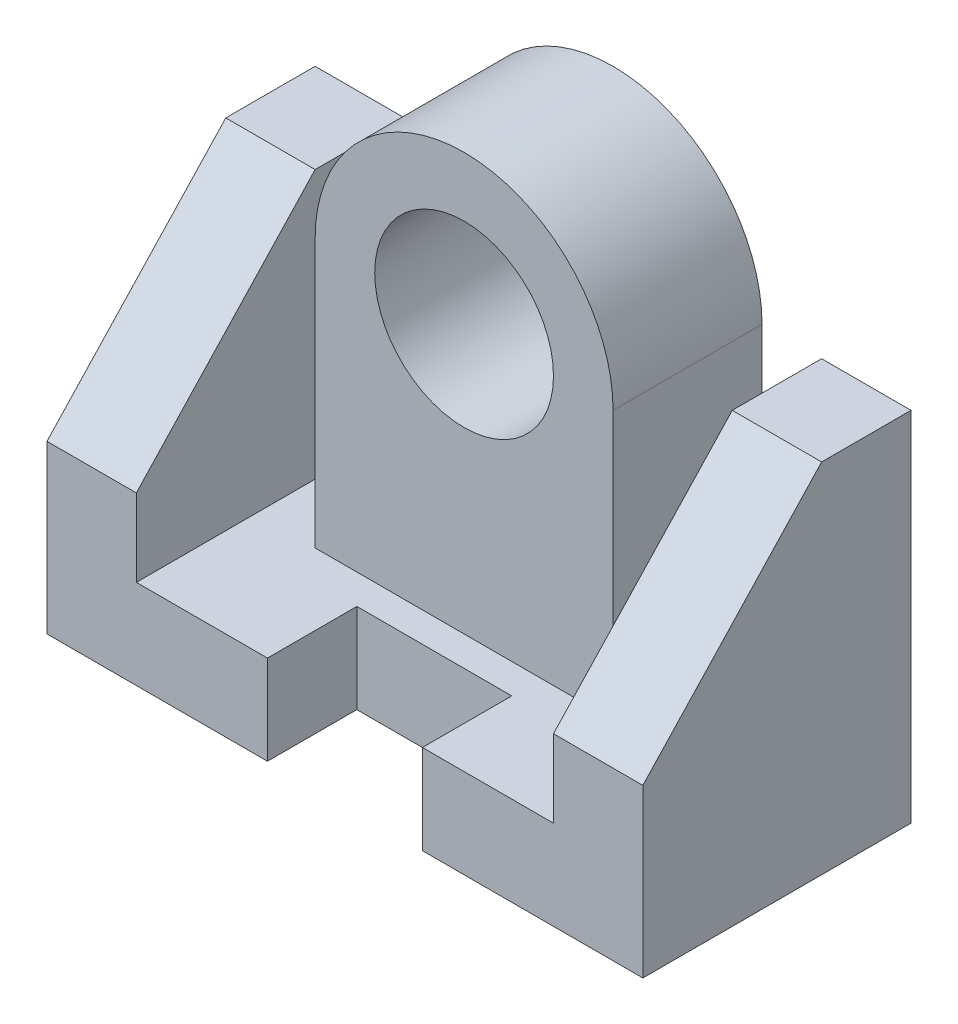
ISO-10303-21;
HEADER;
FILE_DESCRIPTION(('STEP AP214'),'2;1');
FILE_NAME('part.step','',(''),(''),'','','');
FILE_SCHEMA(('AUTOMOTIVE_DESIGN { 1 0 10303 214 1 1 1 1 }'));
ENDSEC;
DATA;
#1=APPLICATION_CONTEXT('core data for automotive mechanical design processes');
#2=APPLICATION_PROTOCOL_DEFINITION('international standard','automotive_design',2000,#1);
#3=PRODUCT_CONTEXT('',#1,'mechanical');
#4=PRODUCT('Part','Part','',(#3));
#5=PRODUCT_RELATED_PRODUCT_CATEGORY('part','',(#4));
#6=PRODUCT_DEFINITION_FORMATION('','',#4);
#7=PRODUCT_DEFINITION_CONTEXT('part definition',#1,'design');
#8=PRODUCT_DEFINITION('design','',#6,#7);
#9=PRODUCT_DEFINITION_SHAPE('','',#8);
#10=(LENGTH_UNIT() NAMED_UNIT(*) SI_UNIT(.MILLI.,.METRE.));
#11=(NAMED_UNIT(*) PLANE_ANGLE_UNIT() SI_UNIT($,.RADIAN.));
#12=(NAMED_UNIT(*) SI_UNIT($,.STERADIAN.) SOLID_ANGLE_UNIT());
#13=UNCERTAINTY_MEASURE_WITH_UNIT(LENGTH_MEASURE(1.E-05),#10,'distance_accuracy_value','');
#14=(GEOMETRIC_REPRESENTATION_CONTEXT(3) GLOBAL_UNCERTAINTY_ASSIGNED_CONTEXT((#13)) GLOBAL_UNIT_ASSIGNED_CONTEXT((#10,
#11,#12)) REPRESENTATION_CONTEXT('',''));
#15=CARTESIAN_POINT('',(0.,0.,0.));
#16=DIRECTION('',(0.,0.,1.));
#17=DIRECTION('',(1.,0.,0.));
#18=AXIS2_PLACEMENT_3D('',#15,#16,#17);
#19=CARTESIAN_POINT('',(-35.,15.,45.));
#20=DIRECTION('',(0.,-1.,0.));
#21=DIRECTION('',(0.,0.,-1.));
#22=AXIS2_PLACEMENT_3D('',#19,#20,#21);
#23=PLANE('',#22);
#24=DIRECTION('',(0.,0.,-1.));
#25=VECTOR('',#24,1.);
#26=CARTESIAN_POINT('',(25.,15.,25.));
#27=LINE('',#26,#25);
#28=CARTESIAN_POINT('',(25.,15.,25.));
#29=VERTEX_POINT('',#28);
#30=CARTESIAN_POINT('',(25.,15.,0.));
#31=VERTEX_POINT('',#30);
#32=EDGE_CURVE('E196',#29,#31,#27,.T.);
#33=ORIENTED_EDGE('',*,*,#32,.F.);
#34=DIRECTION('',(-1.,0.,0.));
#35=VECTOR('',#34,1.);
#36=CARTESIAN_POINT('',(25.,15.,25.));
#37=LINE('',#36,#35);
#38=CARTESIAN_POINT('',(-25.,15.,25.));
#39=VERTEX_POINT('',#38);
#40=EDGE_CURVE('E59',#29,#39,#37,.T.);
#41=ORIENTED_EDGE('',*,*,#40,.T.);
#42=DIRECTION('',(0.,0.,-1.));
#43=VECTOR('',#42,1.);
#44=CARTESIAN_POINT('',(-25.,15.,25.));
#45=LINE('',#44,#43);
#46=CARTESIAN_POINT('',(-25.,15.,0.));
#47=VERTEX_POINT('',#46);
#48=EDGE_CURVE('E65',#39,#47,#45,.T.);
#49=ORIENTED_EDGE('',*,*,#48,.T.);
#50=DIRECTION('',(-1.,0.,0.));
#51=VECTOR('',#50,1.);
#52=CARTESIAN_POINT('',(-35.,15.,0.));
#53=LINE('',#52,#51);
#54=CARTESIAN_POINT('',(-35.,15.,0.));
#55=VERTEX_POINT('',#54);
#56=EDGE_CURVE('E273',#47,#55,#53,.T.);
#57=ORIENTED_EDGE('',*,*,#56,.T.);
#58=DIRECTION('',(0.,0.,-1.));
#59=VECTOR('',#58,1.);
#60=CARTESIAN_POINT('',(-35.,15.,45.));
#61=LINE('',#60,#59);
#62=CARTESIAN_POINT('',(-35.,15.,45.));
#63=VERTEX_POINT('',#62);
#64=EDGE_CURVE('E292',#63,#55,#61,.T.);
#65=ORIENTED_EDGE('',*,*,#64,.F.);
#66=DIRECTION('',(-1.,0.,0.));
#67=VECTOR('',#66,1.);
#68=CARTESIAN_POINT('',(-35.,15.,45.));
#69=LINE('',#68,#67);
#70=CARTESIAN_POINT('',(-13.,15.,45.));
#71=VERTEX_POINT('',#70);
#72=EDGE_CURVE('E255',#71,#63,#69,.T.);
#73=ORIENTED_EDGE('',*,*,#72,.F.);
#74=DIRECTION('',(0.,0.,1.));
#75=VECTOR('',#74,1.);
#76=CARTESIAN_POINT('',(-13.,15.,45.));
#77=LINE('',#76,#75);
#78=CARTESIAN_POINT('',(-13.,15.,30.));
#79=VERTEX_POINT('',#78);
#80=EDGE_CURVE('E208',#79,#71,#77,.T.);
#81=ORIENTED_EDGE('',*,*,#80,.F.);
#82=DIRECTION('',(-1.,0.,0.));
#83=VECTOR('',#82,1.);
#84=CARTESIAN_POINT('',(-13.,15.,30.));
#85=LINE('',#84,#83);
#86=CARTESIAN_POINT('',(13.,15.,30.));
#87=VERTEX_POINT('',#86);
#88=EDGE_CURVE('E216',#87,#79,#85,.T.);
#89=ORIENTED_EDGE('',*,*,#88,.F.);
#90=DIRECTION('',(0.,0.,-1.));
#91=VECTOR('',#90,1.);
#92=CARTESIAN_POINT('',(13.,15.,30.));
#93=LINE('',#92,#91);
#94=CARTESIAN_POINT('',(13.,15.,45.));
#95=VERTEX_POINT('',#94);
#96=EDGE_CURVE('E203',#95,#87,#93,.T.);
#97=ORIENTED_EDGE('',*,*,#96,.F.);
#98=CARTESIAN_POINT('',(35.,15.,45.));
#99=VERTEX_POINT('',#98);
#100=EDGE_CURVE('E254',#99,#95,#69,.T.);
#101=ORIENTED_EDGE('',*,*,#100,.F.);
#102=DIRECTION('',(0.,0.,-1.));
#103=VECTOR('',#102,1.);
#104=CARTESIAN_POINT('',(35.,15.,45.));
#105=LINE('',#104,#103);
#106=CARTESIAN_POINT('',(35.,15.,0.));
#107=VERTEX_POINT('',#106);
#108=EDGE_CURVE('E294',#99,#107,#105,.T.);
#109=ORIENTED_EDGE('',*,*,#108,.T.);
#110=EDGE_CURVE('E274',#107,#31,#53,.T.);
#111=ORIENTED_EDGE('',*,*,#110,.T.);
#112=EDGE_LOOP('',(#33,#41,#49,#57,#65,#73,#81,#89,#97,#101,#109,#111));
#113=FACE_BOUND('',#112,.T.);
#114=ADVANCED_FACE('F41',(#113),#23,.F.);
#115=CARTESIAN_POINT('',(0.,0.,45.));
#116=DIRECTION('',(0.,0.,-1.));
#117=DIRECTION('',(-1.,0.,0.));
#118=AXIS2_PLACEMENT_3D('',#115,#116,#117);
#119=PLANE('',#118);
#120=DIRECTION('',(0.,1.,0.));
#121=VECTOR('',#120,1.);
#122=CARTESIAN_POINT('',(13.,0.,45.));
#123=LINE('',#122,#121);
#124=CARTESIAN_POINT('',(13.,0.,45.));
#125=VERTEX_POINT('',#124);
#126=EDGE_CURVE('E212',#125,#95,#123,.T.);
#127=ORIENTED_EDGE('',*,*,#126,.F.);
#128=DIRECTION('',(1.,0.,0.));
#129=VECTOR('',#128,1.);
#130=CARTESIAN_POINT('',(50.,0.,45.));
#131=LINE('',#130,#129);
#132=CARTESIAN_POINT('',(50.,0.,45.));
#133=VERTEX_POINT('',#132);
#134=EDGE_CURVE('E246',#125,#133,#131,.T.);
#135=ORIENTED_EDGE('',*,*,#134,.T.);
#136=DIRECTION('',(0.,1.,0.));
#137=VECTOR('',#136,1.);
#138=CARTESIAN_POINT('',(50.,60.,45.));
#139=LINE('',#138,#137);
#140=CARTESIAN_POINT('',(50.,28.,45.));
#141=VERTEX_POINT('',#140);
#142=EDGE_CURVE('E249',#133,#141,#139,.T.);
#143=ORIENTED_EDGE('',*,*,#142,.T.);
#144=DIRECTION('',(1.,0.,0.));
#145=VECTOR('',#144,1.);
#146=CARTESIAN_POINT('',(-50.,28.,45.));
#147=LINE('',#146,#145);
#148=CARTESIAN_POINT('',(35.,28.,45.));
#149=VERTEX_POINT('',#148);
#150=EDGE_CURVE('E11',#149,#141,#147,.T.);
#151=ORIENTED_EDGE('',*,*,#150,.F.);
#152=DIRECTION('',(0.,-1.,0.));
#153=VECTOR('',#152,1.);
#154=CARTESIAN_POINT('',(35.,15.,45.));
#155=LINE('',#154,#153);
#156=EDGE_CURVE('E252',#149,#99,#155,.T.);
#157=ORIENTED_EDGE('',*,*,#156,.T.);
#158=ORIENTED_EDGE('',*,*,#100,.T.);
#159=EDGE_LOOP('',(#127,#135,#143,#151,#157,#158));
#160=FACE_BOUND('',#159,.T.);
#161=ADVANCED_FACE('F332',(#160),#119,.F.);
#162=CARTESIAN_POINT('',(50.,60.,45.));
#163=DIRECTION('',(-1.,0.,0.));
#164=DIRECTION('',(0.,0.,1.));
#165=AXIS2_PLACEMENT_3D('',#162,#163,#164);
#166=PLANE('',#165);
#167=DIRECTION('',(0.,0.729537204140085,-0.68394112888133));
#168=VECTOR('',#167,1.);
#169=CARTESIAN_POINT('',(50.,28.,45.));
#170=LINE('',#169,#168);
#171=CARTESIAN_POINT('',(50.,60.,15.));
#172=VERTEX_POINT('',#171);
#173=EDGE_CURVE('E224',#141,#172,#170,.T.);
#174=ORIENTED_EDGE('',*,*,#173,.F.);
#175=ORIENTED_EDGE('',*,*,#142,.F.);
#176=DIRECTION('',(0.,0.,-1.));
#177=VECTOR('',#176,1.);
#178=CARTESIAN_POINT('',(50.,0.,45.));
#179=LINE('',#178,#177);
#180=CARTESIAN_POINT('',(50.,0.,0.));
#181=VERTEX_POINT('',#180);
#182=EDGE_CURVE('E44',#133,#181,#179,.T.);
#183=ORIENTED_EDGE('',*,*,#182,.T.);
#184=DIRECTION('',(0.,1.,0.));
#185=VECTOR('',#184,1.);
#186=CARTESIAN_POINT('',(50.,60.,0.));
#187=LINE('',#186,#185);
#188=CARTESIAN_POINT('',(50.,60.,0.));
#189=VERTEX_POINT('',#188);
#190=EDGE_CURVE('E266',#181,#189,#187,.T.);
#191=ORIENTED_EDGE('',*,*,#190,.T.);
#192=DIRECTION('',(0.,0.,-1.));
#193=VECTOR('',#192,1.);
#194=CARTESIAN_POINT('',(50.,60.,45.));
#195=LINE('',#194,#193);
#196=EDGE_CURVE('E297',#172,#189,#195,.T.);
#197=ORIENTED_EDGE('',*,*,#196,.F.);
#198=EDGE_LOOP('',(#174,#175,#183,#191,#197));
#199=FACE_BOUND('',#198,.T.);
#200=ADVANCED_FACE('F307',(#199),#166,.F.);
#201=CARTESIAN_POINT('',(-50.,0.,45.));
#202=VERTEX_POINT('',#201);
#203=CARTESIAN_POINT('',(-13.,0.,45.));
#204=VERTEX_POINT('',#203);
#205=EDGE_CURVE('E244',#202,#204,#131,.T.);
#206=ORIENTED_EDGE('',*,*,#205,.T.);
#207=DIRECTION('',(0.,1.,0.));
#208=VECTOR('',#207,1.);
#209=CARTESIAN_POINT('',(-13.,0.,45.));
#210=LINE('',#209,#208);
#211=EDGE_CURVE('E219',#204,#71,#210,.T.);
#212=ORIENTED_EDGE('',*,*,#211,.T.);
#213=ORIENTED_EDGE('',*,*,#72,.T.);
#214=DIRECTION('',(0.,1.,0.));
#215=VECTOR('',#214,1.);
#216=CARTESIAN_POINT('',(-35.,60.,45.));
#217=LINE('',#216,#215);
#218=CARTESIAN_POINT('',(-35.,28.,45.));
#219=VERTEX_POINT('',#218);
#220=EDGE_CURVE('E256',#63,#219,#217,.T.);
#221=ORIENTED_EDGE('',*,*,#220,.T.);
#222=CARTESIAN_POINT('',(-50.,28.,45.));
#223=VERTEX_POINT('',#222);
#224=EDGE_CURVE('E51',#223,#219,#147,.T.);
#225=ORIENTED_EDGE('',*,*,#224,.F.);
#226=DIRECTION('',(0.,-1.,0.));
#227=VECTOR('',#226,1.);
#228=CARTESIAN_POINT('',(-50.,0.,45.));
#229=LINE('',#228,#227);
#230=EDGE_CURVE('E261',#223,#202,#229,.T.);
#231=ORIENTED_EDGE('',*,*,#230,.T.);
#232=EDGE_LOOP('',(#206,#212,#213,#221,#225,#231));
#233=FACE_BOUND('',#232,.T.);
#234=ADVANCED_FACE('F341',(#233),#119,.F.);
#235=CARTESIAN_POINT('',(50.,0.,45.));
#236=DIRECTION('',(0.,1.,0.));
#237=DIRECTION('',(0.,0.,1.));
#238=AXIS2_PLACEMENT_3D('',#235,#236,#237);
#239=PLANE('',#238);
#240=DIRECTION('',(-1.,0.,0.));
#241=VECTOR('',#240,1.);
#242=CARTESIAN_POINT('',(-13.,0.,30.));
#243=LINE('',#242,#241);
#244=CARTESIAN_POINT('',(13.,0.,30.));
#245=VERTEX_POINT('',#244);
#246=CARTESIAN_POINT('',(-13.,0.,30.));
#247=VERTEX_POINT('',#246);
#248=EDGE_CURVE('E210',#245,#247,#243,.T.);
#249=ORIENTED_EDGE('',*,*,#248,.T.);
#250=DIRECTION('',(0.,0.,1.));
#251=VECTOR('',#250,1.);
#252=CARTESIAN_POINT('',(-13.,0.,45.));
#253=LINE('',#252,#251);
#254=EDGE_CURVE('E211',#247,#204,#253,.T.);
#255=ORIENTED_EDGE('',*,*,#254,.T.);
#256=ORIENTED_EDGE('',*,*,#205,.F.);
#257=DIRECTION('',(0.,0.,-1.));
#258=VECTOR('',#257,1.);
#259=CARTESIAN_POINT('',(-50.,0.,45.));
#260=LINE('',#259,#258);
#261=CARTESIAN_POINT('',(-50.,0.,0.));
#262=VERTEX_POINT('',#261);
#263=EDGE_CURVE('E263',#202,#262,#260,.T.);
#264=ORIENTED_EDGE('',*,*,#263,.T.);
#265=DIRECTION('',(1.,0.,0.));
#266=VECTOR('',#265,1.);
#267=CARTESIAN_POINT('',(50.,0.,0.));
#268=LINE('',#267,#266);
#269=EDGE_CURVE('E243',#262,#181,#268,.T.);
#270=ORIENTED_EDGE('',*,*,#269,.T.);
#271=ORIENTED_EDGE('',*,*,#182,.F.);
#272=ORIENTED_EDGE('',*,*,#134,.F.);
#273=DIRECTION('',(0.,0.,-1.));
#274=VECTOR('',#273,1.);
#275=CARTESIAN_POINT('',(13.,0.,30.));
#276=LINE('',#275,#274);
#277=EDGE_CURVE('E204',#125,#245,#276,.T.);
#278=ORIENTED_EDGE('',*,*,#277,.T.);
#279=EDGE_LOOP('',(#249,#255,#256,#264,#270,#271,#272,#278));
#280=FACE_BOUND('',#279,.T.);
#281=ADVANCED_FACE('F43',(#280),#239,.F.);
#282=CARTESIAN_POINT('',(35.,60.,45.));
#283=DIRECTION('',(0.,-1.,0.));
#284=DIRECTION('',(0.,0.,-1.));
#285=AXIS2_PLACEMENT_3D('',#282,#283,#284);
#286=PLANE('',#285);
#287=DIRECTION('',(0.,0.,-1.));
#288=VECTOR('',#287,1.);
#289=CARTESIAN_POINT('',(35.,60.,45.));
#290=LINE('',#289,#288);
#291=CARTESIAN_POINT('',(35.,60.,15.));
#292=VERTEX_POINT('',#291);
#293=CARTESIAN_POINT('',(35.,60.,0.));
#294=VERTEX_POINT('',#293);
#295=EDGE_CURVE('E300',#292,#294,#290,.T.);
#296=ORIENTED_EDGE('',*,*,#295,.F.);
#297=DIRECTION('',(1.,0.,0.));
#298=VECTOR('',#297,1.);
#299=CARTESIAN_POINT('',(-50.,60.,15.));
#300=LINE('',#299,#298);
#301=EDGE_CURVE('E234',#292,#172,#300,.T.);
#302=ORIENTED_EDGE('',*,*,#301,.T.);
#303=ORIENTED_EDGE('',*,*,#196,.T.);
#304=DIRECTION('',(-1.,0.,0.));
#305=VECTOR('',#304,1.);
#306=CARTESIAN_POINT('',(35.,60.,0.));
#307=LINE('',#306,#305);
#308=EDGE_CURVE('E267',#189,#294,#307,.T.);
#309=ORIENTED_EDGE('',*,*,#308,.T.);
#310=EDGE_LOOP('',(#296,#302,#303,#309));
#311=FACE_BOUND('',#310,.T.);
#312=ADVANCED_FACE('F321',(#311),#286,.F.);
#313=CARTESIAN_POINT('',(35.,15.,45.));
#314=DIRECTION('',(1.,0.,0.));
#315=DIRECTION('',(0.,0.,-1.));
#316=AXIS2_PLACEMENT_3D('',#313,#314,#315);
#317=PLANE('',#316);
#318=ORIENTED_EDGE('',*,*,#156,.F.);
#319=DIRECTION('',(0.,0.729537204140085,-0.68394112888133));
#320=VECTOR('',#319,1.);
#321=CARTESIAN_POINT('',(35.,21.0810810810811,51.4864864864865));
#322=LINE('',#321,#320);
#323=EDGE_CURVE('E241',#149,#292,#322,.T.);
#324=ORIENTED_EDGE('',*,*,#323,.T.);
#325=ORIENTED_EDGE('',*,*,#295,.T.);
#326=DIRECTION('',(0.,-1.,0.));
#327=VECTOR('',#326,1.);
#328=CARTESIAN_POINT('',(35.,15.,0.));
#329=LINE('',#328,#327);
#330=EDGE_CURVE('E275',#294,#107,#329,.T.);
#331=ORIENTED_EDGE('',*,*,#330,.T.);
#332=ORIENTED_EDGE('',*,*,#108,.F.);
#333=EDGE_LOOP('',(#318,#324,#325,#331,#332));
#334=FACE_BOUND('',#333,.T.);
#335=ADVANCED_FACE('F322',(#334),#317,.F.);
#336=CARTESIAN_POINT('',(-35.,60.,45.));
#337=DIRECTION('',(-1.,0.,0.));
#338=DIRECTION('',(0.,0.,1.));
#339=AXIS2_PLACEMENT_3D('',#336,#337,#338);
#340=PLANE('',#339);
#341=DIRECTION('',(0.,0.,-1.));
#342=VECTOR('',#341,1.);
#343=CARTESIAN_POINT('',(-35.,60.,45.));
#344=LINE('',#343,#342);
#345=CARTESIAN_POINT('',(-35.,60.,15.));
#346=VERTEX_POINT('',#345);
#347=CARTESIAN_POINT('',(-35.,60.,0.));
#348=VERTEX_POINT('',#347);
#349=EDGE_CURVE('E286',#346,#348,#344,.T.);
#350=ORIENTED_EDGE('',*,*,#349,.F.);
#351=DIRECTION('',(0.,-0.729537204140085,0.68394112888133));
#352=VECTOR('',#351,1.);
#353=CARTESIAN_POINT('',(-35.,45.031185031185,29.033264033264));
#354=LINE('',#353,#352);
#355=EDGE_CURVE('E233',#346,#219,#354,.T.);
#356=ORIENTED_EDGE('',*,*,#355,.T.);
#357=ORIENTED_EDGE('',*,*,#220,.F.);
#358=ORIENTED_EDGE('',*,*,#64,.T.);
#359=DIRECTION('',(0.,1.,0.));
#360=VECTOR('',#359,1.);
#361=CARTESIAN_POINT('',(-35.,60.,0.));
#362=LINE('',#361,#360);
#363=EDGE_CURVE('E280',#55,#348,#362,.T.);
#364=ORIENTED_EDGE('',*,*,#363,.T.);
#365=EDGE_LOOP('',(#350,#356,#357,#358,#364));
#366=FACE_BOUND('',#365,.T.);
#367=ADVANCED_FACE('F357',(#366),#340,.F.);
#368=CARTESIAN_POINT('',(-50.,60.,45.));
#369=DIRECTION('',(0.,-1.,0.));
#370=DIRECTION('',(0.,0.,-1.));
#371=AXIS2_PLACEMENT_3D('',#368,#369,#370);
#372=PLANE('',#371);
#373=DIRECTION('',(0.,0.,-1.));
#374=VECTOR('',#373,1.);
#375=CARTESIAN_POINT('',(-50.,60.,45.));
#376=LINE('',#375,#374);
#377=CARTESIAN_POINT('',(-50.,60.,15.));
#378=VERTEX_POINT('',#377);
#379=CARTESIAN_POINT('',(-50.,60.,0.));
#380=VERTEX_POINT('',#379);
#381=EDGE_CURVE('E290',#378,#380,#376,.T.);
#382=ORIENTED_EDGE('',*,*,#381,.F.);
#383=EDGE_CURVE('E237',#378,#346,#300,.T.);
#384=ORIENTED_EDGE('',*,*,#383,.T.);
#385=ORIENTED_EDGE('',*,*,#349,.T.);
#386=DIRECTION('',(-1.,0.,0.));
#387=VECTOR('',#386,1.);
#388=CARTESIAN_POINT('',(-50.,60.,0.));
#389=LINE('',#388,#387);
#390=EDGE_CURVE('E278',#348,#380,#389,.T.);
#391=ORIENTED_EDGE('',*,*,#390,.T.);
#392=EDGE_LOOP('',(#382,#384,#385,#391));
#393=FACE_BOUND('',#392,.T.);
#394=ADVANCED_FACE('F355',(#393),#372,.F.);
#395=CARTESIAN_POINT('',(-50.,0.,45.));
#396=DIRECTION('',(1.,0.,0.));
#397=DIRECTION('',(0.,0.,-1.));
#398=AXIS2_PLACEMENT_3D('',#395,#396,#397);
#399=PLANE('',#398);
#400=ORIENTED_EDGE('',*,*,#230,.F.);
#401=DIRECTION('',(0.,0.729537204140085,-0.68394112888133));
#402=VECTOR('',#401,1.);
#403=CARTESIAN_POINT('',(-50.,28.,45.));
#404=LINE('',#403,#402);
#405=EDGE_CURVE('E229',#223,#378,#404,.T.);
#406=ORIENTED_EDGE('',*,*,#405,.T.);
#407=ORIENTED_EDGE('',*,*,#381,.T.);
#408=DIRECTION('',(0.,-1.,0.));
#409=VECTOR('',#408,1.);
#410=CARTESIAN_POINT('',(-50.,0.,0.));
#411=LINE('',#410,#409);
#412=EDGE_CURVE('E282',#380,#262,#411,.T.);
#413=ORIENTED_EDGE('',*,*,#412,.T.);
#414=ORIENTED_EDGE('',*,*,#263,.F.);
#415=EDGE_LOOP('',(#400,#406,#407,#413,#414));
#416=FACE_BOUND('',#415,.T.);
#417=ADVANCED_FACE('F349',(#416),#399,.F.);
#418=CARTESIAN_POINT('',(0.,0.,0.));
#419=DIRECTION('',(0.,0.,-1.));
#420=DIRECTION('',(-1.,0.,0.));
#421=AXIS2_PLACEMENT_3D('',#418,#419,#420);
#422=PLANE('',#421);
#423=CARTESIAN_POINT('',(0.,60.,0.));
#424=DIRECTION('',(0.,0.,1.));
#425=DIRECTION('',(1.,0.,0.));
#426=AXIS2_PLACEMENT_3D('',#423,#424,#425);
#427=CIRCLE('',#426,15.);
#428=CARTESIAN_POINT('',(15.,60.,0.));
#429=VERTEX_POINT('',#428);
#430=EDGE_CURVE('E191',#429,#429,#427,.T.);
#431=ORIENTED_EDGE('',*,*,#430,.T.);
#432=EDGE_LOOP('',(#431));
#433=FACE_BOUND('',#432,.T.);
#434=ORIENTED_EDGE('',*,*,#269,.F.);
#435=ORIENTED_EDGE('',*,*,#412,.F.);
#436=ORIENTED_EDGE('',*,*,#390,.F.);
#437=ORIENTED_EDGE('',*,*,#363,.F.);
#438=ORIENTED_EDGE('',*,*,#56,.F.);
#439=DIRECTION('',(0.,1.,0.));
#440=VECTOR('',#439,1.);
#441=CARTESIAN_POINT('',(-25.,15.,0.));
#442=LINE('',#441,#440);
#443=CARTESIAN_POINT('',(-25.,60.,0.));
#444=VERTEX_POINT('',#443);
#445=EDGE_CURVE('E195',#47,#444,#442,.T.);
#446=ORIENTED_EDGE('',*,*,#445,.T.);
#447=CARTESIAN_POINT('',(0.,60.,0.));
#448=DIRECTION('',(0.,0.,-1.));
#449=DIRECTION('',(-1.,0.,0.));
#450=AXIS2_PLACEMENT_3D('',#447,#448,#449);
#451=CIRCLE('',#450,25.);
#452=CARTESIAN_POINT('',(25.,60.,0.));
#453=VERTEX_POINT('',#452);
#454=EDGE_CURVE('E171',#444,#453,#451,.T.);
#455=ORIENTED_EDGE('',*,*,#454,.T.);
#456=DIRECTION('',(0.,-1.,0.));
#457=VECTOR('',#456,1.);
#458=CARTESIAN_POINT('',(25.,60.,0.));
#459=LINE('',#458,#457);
#460=EDGE_CURVE('E190',#453,#31,#459,.T.);
#461=ORIENTED_EDGE('',*,*,#460,.T.);
#462=ORIENTED_EDGE('',*,*,#110,.F.);
#463=ORIENTED_EDGE('',*,*,#330,.F.);
#464=ORIENTED_EDGE('',*,*,#308,.F.);
#465=ORIENTED_EDGE('',*,*,#190,.F.);
#466=EDGE_LOOP('',(#434,#435,#436,#437,#438,#446,#455,#461,#462,#463,#464,#465));
#467=FACE_BOUND('',#466,.T.);
#468=ADVANCED_FACE('F316',(#433,#467),#422,.T.);
#469=CARTESIAN_POINT('',(-50.,28.,45.));
#470=DIRECTION('',(0.,-0.68394112888133,-0.729537204140085));
#471=DIRECTION('',(0.,0.729537204140085,-0.68394112888133));
#472=AXIS2_PLACEMENT_3D('',#469,#470,#471);
#473=PLANE('',#472);
#474=ORIENTED_EDGE('',*,*,#383,.F.);
#475=ORIENTED_EDGE('',*,*,#405,.F.);
#476=ORIENTED_EDGE('',*,*,#224,.T.);
#477=ORIENTED_EDGE('',*,*,#355,.F.);
#478=EDGE_LOOP('',(#474,#475,#476,#477));
#479=FACE_BOUND('',#478,.T.);
#480=ADVANCED_FACE('F394',(#479),#473,.F.);
#481=ORIENTED_EDGE('',*,*,#150,.T.);
#482=ORIENTED_EDGE('',*,*,#173,.T.);
#483=ORIENTED_EDGE('',*,*,#301,.F.);
#484=ORIENTED_EDGE('',*,*,#323,.F.);
#485=EDGE_LOOP('',(#481,#482,#483,#484));
#486=FACE_BOUND('',#485,.T.);
#487=ADVANCED_FACE('F327',(#486),#473,.F.);
#488=CARTESIAN_POINT('',(-13.,0.,45.));
#489=DIRECTION('',(-1.,0.,0.));
#490=DIRECTION('',(0.,0.,1.));
#491=AXIS2_PLACEMENT_3D('',#488,#489,#490);
#492=PLANE('',#491);
#493=ORIENTED_EDGE('',*,*,#80,.T.);
#494=ORIENTED_EDGE('',*,*,#211,.F.);
#495=ORIENTED_EDGE('',*,*,#254,.F.);
#496=DIRECTION('',(0.,1.,0.));
#497=VECTOR('',#496,1.);
#498=CARTESIAN_POINT('',(-13.,0.,30.));
#499=LINE('',#498,#497);
#500=EDGE_CURVE('E221',#247,#79,#499,.T.);
#501=ORIENTED_EDGE('',*,*,#500,.T.);
#502=EDGE_LOOP('',(#493,#494,#495,#501));
#503=FACE_BOUND('',#502,.T.);
#504=ADVANCED_FACE('F345',(#503),#492,.F.);
#505=CARTESIAN_POINT('',(-13.,0.,30.));
#506=DIRECTION('',(0.,0.,-1.));
#507=DIRECTION('',(-1.,0.,0.));
#508=AXIS2_PLACEMENT_3D('',#505,#506,#507);
#509=PLANE('',#508);
#510=ORIENTED_EDGE('',*,*,#88,.T.);
#511=ORIENTED_EDGE('',*,*,#500,.F.);
#512=ORIENTED_EDGE('',*,*,#248,.F.);
#513=DIRECTION('',(0.,1.,0.));
#514=VECTOR('',#513,1.);
#515=CARTESIAN_POINT('',(13.,0.,30.));
#516=LINE('',#515,#514);
#517=EDGE_CURVE('E226',#245,#87,#516,.T.);
#518=ORIENTED_EDGE('',*,*,#517,.T.);
#519=EDGE_LOOP('',(#510,#511,#512,#518));
#520=FACE_BOUND('',#519,.T.);
#521=ADVANCED_FACE('F337',(#520),#509,.F.);
#522=CARTESIAN_POINT('',(13.,0.,30.));
#523=DIRECTION('',(1.,0.,0.));
#524=DIRECTION('',(0.,0.,-1.));
#525=AXIS2_PLACEMENT_3D('',#522,#523,#524);
#526=PLANE('',#525);
#527=ORIENTED_EDGE('',*,*,#96,.T.);
#528=ORIENTED_EDGE('',*,*,#517,.F.);
#529=ORIENTED_EDGE('',*,*,#277,.F.);
#530=ORIENTED_EDGE('',*,*,#126,.T.);
#531=EDGE_LOOP('',(#527,#528,#529,#530));
#532=FACE_BOUND('',#531,.T.);
#533=ADVANCED_FACE('F331',(#532),#526,.F.);
#534=CARTESIAN_POINT('',(25.,60.,25.));
#535=DIRECTION('',(1.,0.,0.));
#536=DIRECTION('',(0.,0.,-1.));
#537=AXIS2_PLACEMENT_3D('',#534,#535,#536);
#538=PLANE('',#537);
#539=ORIENTED_EDGE('',*,*,#460,.F.);
#540=DIRECTION('',(0.,0.,-1.));
#541=VECTOR('',#540,1.);
#542=CARTESIAN_POINT('',(25.,60.,25.));
#543=LINE('',#542,#541);
#544=CARTESIAN_POINT('',(25.,60.,25.));
#545=VERTEX_POINT('',#544);
#546=EDGE_CURVE('E177',#545,#453,#543,.T.);
#547=ORIENTED_EDGE('',*,*,#546,.F.);
#548=DIRECTION('',(0.,-1.,0.));
#549=VECTOR('',#548,1.);
#550=CARTESIAN_POINT('',(25.,60.,25.));
#551=LINE('',#550,#549);
#552=EDGE_CURVE('E181',#545,#29,#551,.T.);
#553=ORIENTED_EDGE('',*,*,#552,.T.);
#554=ORIENTED_EDGE('',*,*,#32,.T.);
#555=EDGE_LOOP('',(#539,#547,#553,#554));
#556=FACE_BOUND('',#555,.T.);
#557=ADVANCED_FACE('F362',(#556),#538,.T.);
#558=CARTESIAN_POINT('',(0.,60.,25.));
#559=DIRECTION('',(0.,0.,-1.));
#560=DIRECTION('',(-1.,0.,0.));
#561=AXIS2_PLACEMENT_3D('',#558,#559,#560);
#562=CYLINDRICAL_SURFACE('',#561,25.);
#563=ORIENTED_EDGE('',*,*,#454,.F.);
#564=DIRECTION('',(0.,0.,-1.));
#565=VECTOR('',#564,1.);
#566=CARTESIAN_POINT('',(-25.,60.,25.));
#567=LINE('',#566,#565);
#568=CARTESIAN_POINT('',(-25.,60.,25.));
#569=VERTEX_POINT('',#568);
#570=EDGE_CURVE('E164',#569,#444,#567,.T.);
#571=ORIENTED_EDGE('',*,*,#570,.F.);
#572=CARTESIAN_POINT('',(0.,60.,25.));
#573=DIRECTION('',(0.,0.,-1.));
#574=DIRECTION('',(-1.,0.,0.));
#575=AXIS2_PLACEMENT_3D('',#572,#573,#574);
#576=CIRCLE('',#575,25.);
#577=EDGE_CURVE('E169',#569,#545,#576,.T.);
#578=ORIENTED_EDGE('',*,*,#577,.T.);
#579=ORIENTED_EDGE('',*,*,#546,.T.);
#580=EDGE_LOOP('',(#563,#571,#578,#579));
#581=FACE_BOUND('',#580,.T.);
#582=ADVANCED_FACE('F170',(#581),#562,.T.);
#583=CARTESIAN_POINT('',(-25.,15.,25.));
#584=DIRECTION('',(-1.,0.,0.));
#585=DIRECTION('',(0.,0.,1.));
#586=AXIS2_PLACEMENT_3D('',#583,#584,#585);
#587=PLANE('',#586);
#588=ORIENTED_EDGE('',*,*,#445,.F.);
#589=ORIENTED_EDGE('',*,*,#48,.F.);
#590=DIRECTION('',(0.,1.,0.));
#591=VECTOR('',#590,1.);
#592=CARTESIAN_POINT('',(-25.,15.,25.));
#593=LINE('',#592,#591);
#594=EDGE_CURVE('E182',#39,#569,#593,.T.);
#595=ORIENTED_EDGE('',*,*,#594,.T.);
#596=ORIENTED_EDGE('',*,*,#570,.T.);
#597=EDGE_LOOP('',(#588,#589,#595,#596));
#598=FACE_BOUND('',#597,.T.);
#599=ADVANCED_FACE('F183',(#598),#587,.T.);
#600=CARTESIAN_POINT('',(0.,60.,25.));
#601=DIRECTION('',(0.,0.,-1.));
#602=DIRECTION('',(-1.,0.,0.));
#603=AXIS2_PLACEMENT_3D('',#600,#601,#602);
#604=PLANE('',#603);
#605=CARTESIAN_POINT('',(0.,60.,25.));
#606=DIRECTION('',(0.,0.,1.));
#607=DIRECTION('',(1.,0.,0.));
#608=AXIS2_PLACEMENT_3D('',#605,#606,#607);
#609=CIRCLE('',#608,15.);
#610=CARTESIAN_POINT('',(15.,60.,25.));
#611=VERTEX_POINT('',#610);
#612=EDGE_CURVE('E496',#611,#611,#609,.T.);
#613=ORIENTED_EDGE('',*,*,#612,.F.);
#614=EDGE_LOOP('',(#613));
#615=FACE_BOUND('',#614,.T.);
#616=ORIENTED_EDGE('',*,*,#40,.F.);
#617=ORIENTED_EDGE('',*,*,#552,.F.);
#618=ORIENTED_EDGE('',*,*,#577,.F.);
#619=ORIENTED_EDGE('',*,*,#594,.F.);
#620=EDGE_LOOP('',(#616,#617,#618,#619));
#621=FACE_BOUND('',#620,.T.);
#622=ADVANCED_FACE('F178',(#615,#621),#604,.F.);
#623=CARTESIAN_POINT('',(0.,60.,0.));
#624=DIRECTION('',(0.,0.,1.));
#625=DIRECTION('',(1.,0.,0.));
#626=AXIS2_PLACEMENT_3D('',#623,#624,#625);
#627=CYLINDRICAL_SURFACE('',#626,15.);
#628=ORIENTED_EDGE('',*,*,#430,.F.);
#629=EDGE_LOOP('',(#628));
#630=FACE_BOUND('',#629,.T.);
#631=ORIENTED_EDGE('',*,*,#612,.T.);
#632=EDGE_LOOP('',(#631));
#633=FACE_BOUND('',#632,.T.);
#634=ADVANCED_FACE('F485',(#630,#633),#627,.F.);
#635=CLOSED_SHELL('',(#114,#161,#200,#234,#281,#312,#335,#367,#394,#417,#468,#480,#487,#504,
#521,#533,#557,#582,#599,#622,#634));
#636=MANIFOLD_SOLID_BREP('B2',#635);
#637=ADVANCED_BREP_SHAPE_REPRESENTATION('',(#18,#636),#14);
#638=SHAPE_DEFINITION_REPRESENTATION(#9,#637);
ENDSEC;
END-ISO-10303-21;
